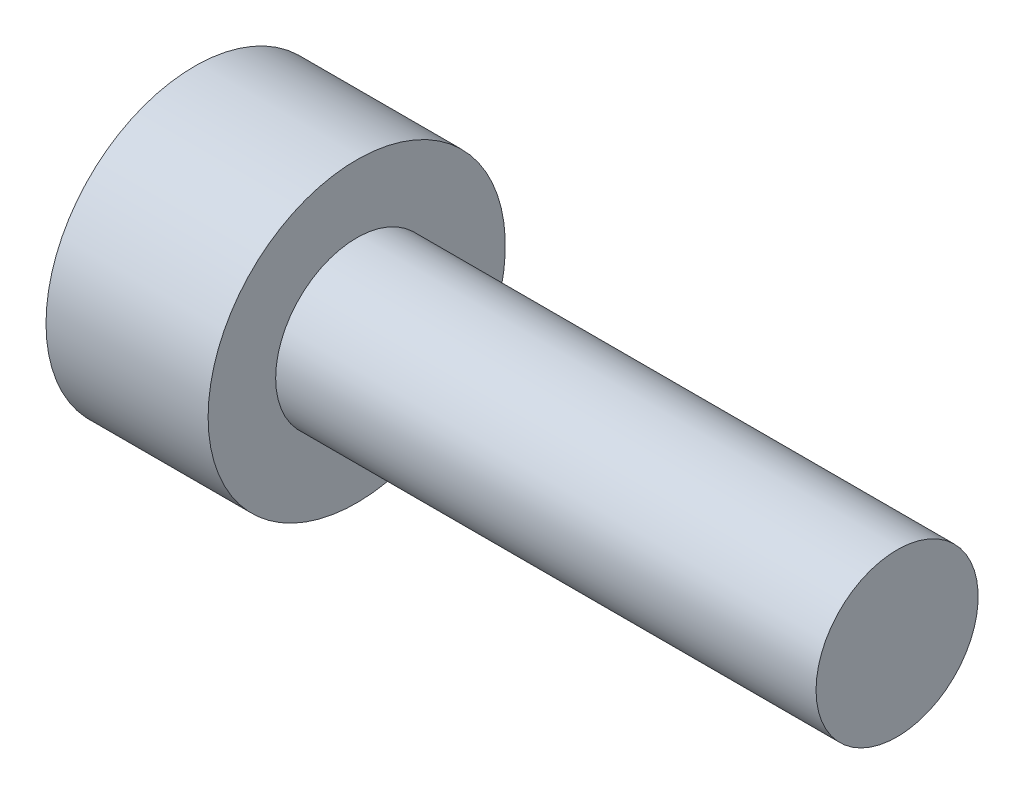
ISO-10303-21;
HEADER;
FILE_DESCRIPTION(('STEP AP214'),'2;1');
FILE_NAME('part.step','',(''),(''),'','','');
FILE_SCHEMA(('AUTOMOTIVE_DESIGN { 1 0 10303 214 1 1 1 1 }'));
ENDSEC;
DATA;
#1=APPLICATION_CONTEXT('core data for automotive mechanical design processes');
#2=APPLICATION_PROTOCOL_DEFINITION('international standard','automotive_design',2000,#1);
#3=PRODUCT_CONTEXT('',#1,'mechanical');
#4=PRODUCT('Part','Part','',(#3));
#5=PRODUCT_RELATED_PRODUCT_CATEGORY('part','',(#4));
#6=PRODUCT_DEFINITION_FORMATION('','',#4);
#7=PRODUCT_DEFINITION_CONTEXT('part definition',#1,'design');
#8=PRODUCT_DEFINITION('design','',#6,#7);
#9=PRODUCT_DEFINITION_SHAPE('','',#8);
#10=(LENGTH_UNIT() NAMED_UNIT(*) SI_UNIT(.MILLI.,.METRE.));
#11=(NAMED_UNIT(*) PLANE_ANGLE_UNIT() SI_UNIT($,.RADIAN.));
#12=(NAMED_UNIT(*) SI_UNIT($,.STERADIAN.) SOLID_ANGLE_UNIT());
#13=UNCERTAINTY_MEASURE_WITH_UNIT(LENGTH_MEASURE(1.E-05),#10,'distance_accuracy_value','');
#14=(GEOMETRIC_REPRESENTATION_CONTEXT(3) GLOBAL_UNCERTAINTY_ASSIGNED_CONTEXT((#13)) GLOBAL_UNIT_ASSIGNED_CONTEXT((#10,
#11,#12)) REPRESENTATION_CONTEXT('',''));
#15=CARTESIAN_POINT('',(0.,0.,0.));
#16=DIRECTION('',(0.,0.,1.));
#17=DIRECTION('',(1.,0.,0.));
#18=AXIS2_PLACEMENT_3D('',#15,#16,#17);
#19=CARTESIAN_POINT('',(128.7,2.75,0.));
#20=DIRECTION('',(1.,0.,0.));
#21=DIRECTION('',(0.,0.,-1.));
#22=AXIS2_PLACEMENT_3D('',#19,#20,#21);
#23=PLANE('',#22);
#24=CARTESIAN_POINT('',(128.7,0.,0.));
#25=DIRECTION('',(-1.,0.,0.));
#26=DIRECTION('',(0.,0.,1.));
#27=AXIS2_PLACEMENT_3D('',#24,#25,#26);
#28=CIRCLE('',#27,2.75);
#29=CARTESIAN_POINT('',(128.7,0.,2.75));
#30=VERTEX_POINT('',#29);
#31=EDGE_CURVE('E45',#30,#30,#28,.T.);
#32=ORIENTED_EDGE('',*,*,#31,.T.);
#33=EDGE_LOOP('',(#32));
#34=FACE_BOUND('',#33,.T.);
#35=ADVANCED_FACE('F31',(#34),#23,.F.);
#36=CARTESIAN_POINT('',(141.7,0.,0.));
#37=DIRECTION('',(-1.,0.,0.));
#38=DIRECTION('',(0.,0.,1.));
#39=AXIS2_PLACEMENT_3D('',#36,#37,#38);
#40=PLANE('',#39);
#41=CARTESIAN_POINT('',(141.7,0.,0.));
#42=DIRECTION('',(-1.,0.,0.));
#43=DIRECTION('',(0.,0.,1.));
#44=AXIS2_PLACEMENT_3D('',#41,#42,#43);
#45=CIRCLE('',#44,1.5);
#46=CARTESIAN_POINT('',(141.7,0.,1.5));
#47=VERTEX_POINT('',#46);
#48=EDGE_CURVE('E10',#47,#47,#45,.T.);
#49=ORIENTED_EDGE('',*,*,#48,.F.);
#50=EDGE_LOOP('',(#49));
#51=FACE_BOUND('',#50,.T.);
#52=ADVANCED_FACE('F65',(#51),#40,.F.);
#53=CARTESIAN_POINT('',(-110.,0.,0.));
#54=DIRECTION('',(-1.,0.,0.));
#55=DIRECTION('',(0.,0.,1.));
#56=AXIS2_PLACEMENT_3D('',#53,#54,#55);
#57=CYLINDRICAL_SURFACE('',#56,1.5);
#58=CARTESIAN_POINT('',(131.7,0.,0.));
#59=DIRECTION('',(-1.,0.,0.));
#60=DIRECTION('',(0.,0.,1.));
#61=AXIS2_PLACEMENT_3D('',#58,#59,#60);
#62=CIRCLE('',#61,1.5);
#63=CARTESIAN_POINT('',(131.7,0.,1.5));
#64=VERTEX_POINT('',#63);
#65=EDGE_CURVE('E37',#64,#64,#62,.T.);
#66=ORIENTED_EDGE('',*,*,#65,.F.);
#67=EDGE_LOOP('',(#66));
#68=FACE_BOUND('',#67,.T.);
#69=ORIENTED_EDGE('',*,*,#48,.T.);
#70=EDGE_LOOP('',(#69));
#71=FACE_BOUND('',#70,.T.);
#72=ADVANCED_FACE('F60',(#68,#71),#57,.T.);
#73=CARTESIAN_POINT('',(131.7,1.5,0.));
#74=DIRECTION('',(-1.,0.,0.));
#75=DIRECTION('',(0.,0.,1.));
#76=AXIS2_PLACEMENT_3D('',#73,#74,#75);
#77=PLANE('',#76);
#78=CARTESIAN_POINT('',(131.7,0.,0.));
#79=DIRECTION('',(-1.,0.,0.));
#80=DIRECTION('',(0.,0.,1.));
#81=AXIS2_PLACEMENT_3D('',#78,#79,#80);
#82=CIRCLE('',#81,2.75);
#83=CARTESIAN_POINT('',(131.7,0.,2.75));
#84=VERTEX_POINT('',#83);
#85=EDGE_CURVE('E41',#84,#84,#82,.T.);
#86=ORIENTED_EDGE('',*,*,#85,.F.);
#87=EDGE_LOOP('',(#86));
#88=FACE_BOUND('',#87,.T.);
#89=ORIENTED_EDGE('',*,*,#65,.T.);
#90=EDGE_LOOP('',(#89));
#91=FACE_BOUND('',#90,.T.);
#92=ADVANCED_FACE('F55',(#88,#91),#77,.F.);
#93=CARTESIAN_POINT('',(-110.,0.,0.));
#94=DIRECTION('',(-1.,0.,0.));
#95=DIRECTION('',(0.,0.,1.));
#96=AXIS2_PLACEMENT_3D('',#93,#94,#95);
#97=CYLINDRICAL_SURFACE('',#96,2.75);
#98=ORIENTED_EDGE('',*,*,#31,.F.);
#99=EDGE_LOOP('',(#98));
#100=FACE_BOUND('',#99,.T.);
#101=ORIENTED_EDGE('',*,*,#85,.T.);
#102=EDGE_LOOP('',(#101));
#103=FACE_BOUND('',#102,.T.);
#104=ADVANCED_FACE('F52',(#100,#103),#97,.T.);
#105=CLOSED_SHELL('',(#35,#52,#72,#92,#104));
#106=MANIFOLD_SOLID_BREP('B2',#105);
#107=ADVANCED_BREP_SHAPE_REPRESENTATION('',(#18,#106),#14);
#108=SHAPE_DEFINITION_REPRESENTATION(#9,#107);
ENDSEC;
END-ISO-10303-21;
